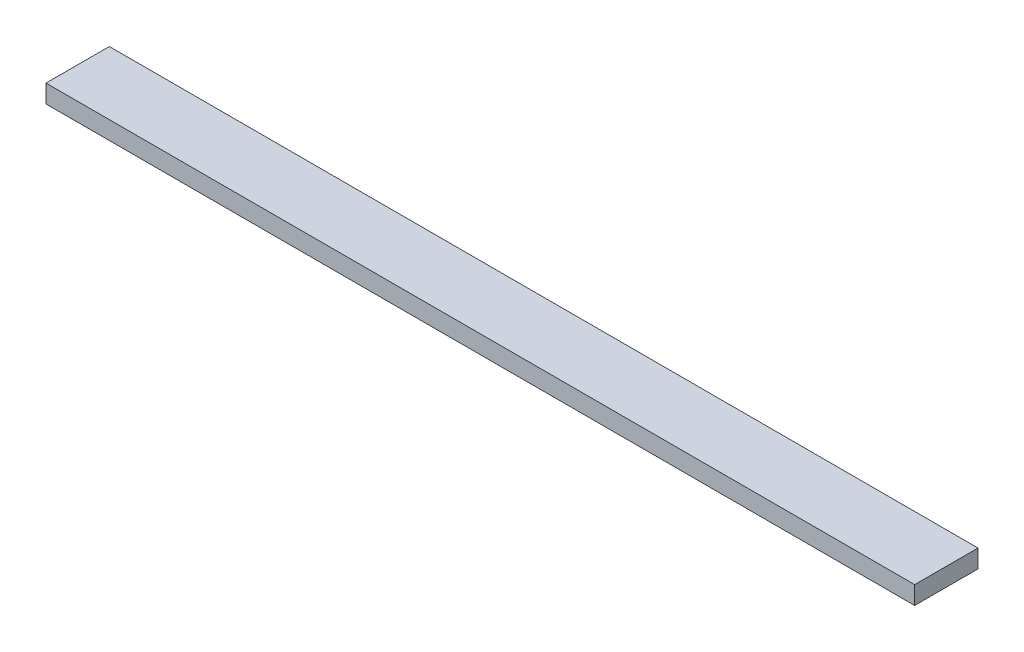
ISO-10303-21;
HEADER;
FILE_DESCRIPTION(('STEP AP214'),'2;1');
FILE_NAME('part.step','',(''),(''),'','','');
FILE_SCHEMA(('AUTOMOTIVE_DESIGN { 1 0 10303 214 1 1 1 1 }'));
ENDSEC;
DATA;
#1=APPLICATION_CONTEXT('core data for automotive mechanical design processes');
#2=APPLICATION_PROTOCOL_DEFINITION('international standard','automotive_design',2000,#1);
#3=PRODUCT_CONTEXT('',#1,'mechanical');
#4=PRODUCT('Part','Part','',(#3));
#5=PRODUCT_RELATED_PRODUCT_CATEGORY('part','',(#4));
#6=PRODUCT_DEFINITION_FORMATION('','',#4);
#7=PRODUCT_DEFINITION_CONTEXT('part definition',#1,'design');
#8=PRODUCT_DEFINITION('design','',#6,#7);
#9=PRODUCT_DEFINITION_SHAPE('','',#8);
#10=(LENGTH_UNIT() NAMED_UNIT(*) SI_UNIT(.MILLI.,.METRE.));
#11=(NAMED_UNIT(*) PLANE_ANGLE_UNIT() SI_UNIT($,.RADIAN.));
#12=(NAMED_UNIT(*) SI_UNIT($,.STERADIAN.) SOLID_ANGLE_UNIT());
#13=UNCERTAINTY_MEASURE_WITH_UNIT(LENGTH_MEASURE(1.E-05),#10,'distance_accuracy_value','');
#14=(GEOMETRIC_REPRESENTATION_CONTEXT(3) GLOBAL_UNCERTAINTY_ASSIGNED_CONTEXT((#13)) GLOBAL_UNIT_ASSIGNED_CONTEXT((#10,
#11,#12)) REPRESENTATION_CONTEXT('',''));
#15=CARTESIAN_POINT('',(0.,0.,0.));
#16=DIRECTION('',(0.,0.,1.));
#17=DIRECTION('',(1.,0.,0.));
#18=AXIS2_PLACEMENT_3D('',#15,#16,#17);
#19=CARTESIAN_POINT('',(152.4,6.35,11.1125));
#20=DIRECTION('',(-1.,0.,0.));
#21=DIRECTION('',(0.,0.,1.));
#22=AXIS2_PLACEMENT_3D('',#19,#20,#21);
#23=PLANE('',#22);
#24=DIRECTION('',(0.,0.,-1.));
#25=VECTOR('',#24,1.);
#26=CARTESIAN_POINT('',(152.4,0.,11.1125));
#27=LINE('',#26,#25);
#28=CARTESIAN_POINT('',(152.4,0.,11.1125));
#29=VERTEX_POINT('',#28);
#30=CARTESIAN_POINT('',(152.4,0.,-11.1125));
#31=VERTEX_POINT('',#30);
#32=EDGE_CURVE('E96',#29,#31,#27,.T.);
#33=ORIENTED_EDGE('',*,*,#32,.T.);
#34=DIRECTION('',(0.,-1.,0.));
#35=VECTOR('',#34,1.);
#36=CARTESIAN_POINT('',(152.4,6.35,-11.1125));
#37=LINE('',#36,#35);
#38=CARTESIAN_POINT('',(152.4,6.35,-11.1125));
#39=VERTEX_POINT('',#38);
#40=EDGE_CURVE('E11',#39,#31,#37,.T.);
#41=ORIENTED_EDGE('',*,*,#40,.F.);
#42=DIRECTION('',(0.,0.,-1.));
#43=VECTOR('',#42,1.);
#44=CARTESIAN_POINT('',(152.4,6.35,11.1125));
#45=LINE('',#44,#43);
#46=CARTESIAN_POINT('',(152.4,6.35,11.1125));
#47=VERTEX_POINT('',#46);
#48=EDGE_CURVE('E84',#47,#39,#45,.T.);
#49=ORIENTED_EDGE('',*,*,#48,.F.);
#50=DIRECTION('',(0.,-1.,0.));
#51=VECTOR('',#50,1.);
#52=CARTESIAN_POINT('',(152.4,6.35,11.1125));
#53=LINE('',#52,#51);
#54=EDGE_CURVE('E92',#47,#29,#53,.T.);
#55=ORIENTED_EDGE('',*,*,#54,.T.);
#56=EDGE_LOOP('',(#33,#41,#49,#55));
#57=FACE_BOUND('',#56,.T.);
#58=ADVANCED_FACE('F33',(#57),#23,.F.);
#59=CARTESIAN_POINT('',(-152.4,6.35,-11.1125));
#60=DIRECTION('',(0.,0.,1.));
#61=DIRECTION('',(1.,0.,0.));
#62=AXIS2_PLACEMENT_3D('',#59,#60,#61);
#63=PLANE('',#62);
#64=DIRECTION('',(-1.,0.,0.));
#65=VECTOR('',#64,1.);
#66=CARTESIAN_POINT('',(-152.4,0.,-11.1125));
#67=LINE('',#66,#65);
#68=CARTESIAN_POINT('',(-152.4,0.,-11.1125));
#69=VERTEX_POINT('',#68);
#70=EDGE_CURVE('E88',#31,#69,#67,.T.);
#71=ORIENTED_EDGE('',*,*,#70,.T.);
#72=DIRECTION('',(0.,-1.,0.));
#73=VECTOR('',#72,1.);
#74=CARTESIAN_POINT('',(-152.4,6.35,-11.1125));
#75=LINE('',#74,#73);
#76=CARTESIAN_POINT('',(-152.4,6.35,-11.1125));
#77=VERTEX_POINT('',#76);
#78=EDGE_CURVE('E41',#77,#69,#75,.T.);
#79=ORIENTED_EDGE('',*,*,#78,.F.);
#80=DIRECTION('',(-1.,0.,0.));
#81=VECTOR('',#80,1.);
#82=CARTESIAN_POINT('',(-152.4,6.35,-11.1125));
#83=LINE('',#82,#81);
#84=EDGE_CURVE('E79',#39,#77,#83,.T.);
#85=ORIENTED_EDGE('',*,*,#84,.F.);
#86=ORIENTED_EDGE('',*,*,#40,.T.);
#87=EDGE_LOOP('',(#71,#79,#85,#86));
#88=FACE_BOUND('',#87,.T.);
#89=ADVANCED_FACE('F87',(#88),#63,.F.);
#90=CARTESIAN_POINT('',(-152.4,6.35,11.1125));
#91=DIRECTION('',(1.,0.,0.));
#92=DIRECTION('',(0.,0.,-1.));
#93=AXIS2_PLACEMENT_3D('',#90,#91,#92);
#94=PLANE('',#93);
#95=DIRECTION('',(0.,0.,1.));
#96=VECTOR('',#95,1.);
#97=CARTESIAN_POINT('',(-152.4,0.,11.1125));
#98=LINE('',#97,#96);
#99=CARTESIAN_POINT('',(-152.4,0.,11.1125));
#100=VERTEX_POINT('',#99);
#101=EDGE_CURVE('E66',#69,#100,#98,.T.);
#102=ORIENTED_EDGE('',*,*,#101,.T.);
#103=DIRECTION('',(0.,-1.,0.));
#104=VECTOR('',#103,1.);
#105=CARTESIAN_POINT('',(-152.4,6.35,11.1125));
#106=LINE('',#105,#104);
#107=CARTESIAN_POINT('',(-152.4,6.35,11.1125));
#108=VERTEX_POINT('',#107);
#109=EDGE_CURVE('E89',#108,#100,#106,.T.);
#110=ORIENTED_EDGE('',*,*,#109,.F.);
#111=DIRECTION('',(0.,0.,1.));
#112=VECTOR('',#111,1.);
#113=CARTESIAN_POINT('',(-152.4,6.35,11.1125));
#114=LINE('',#113,#112);
#115=EDGE_CURVE('E82',#77,#108,#114,.T.);
#116=ORIENTED_EDGE('',*,*,#115,.F.);
#117=ORIENTED_EDGE('',*,*,#78,.T.);
#118=EDGE_LOOP('',(#102,#110,#116,#117));
#119=FACE_BOUND('',#118,.T.);
#120=ADVANCED_FACE('F90',(#119),#94,.F.);
#121=CARTESIAN_POINT('',(-152.4,6.35,11.1125));
#122=DIRECTION('',(0.,0.,-1.));
#123=DIRECTION('',(-1.,0.,0.));
#124=AXIS2_PLACEMENT_3D('',#121,#122,#123);
#125=PLANE('',#124);
#126=DIRECTION('',(1.,0.,0.));
#127=VECTOR('',#126,1.);
#128=CARTESIAN_POINT('',(-152.4,0.,11.1125));
#129=LINE('',#128,#127);
#130=EDGE_CURVE('E72',#100,#29,#129,.T.);
#131=ORIENTED_EDGE('',*,*,#130,.T.);
#132=ORIENTED_EDGE('',*,*,#54,.F.);
#133=DIRECTION('',(1.,0.,0.));
#134=VECTOR('',#133,1.);
#135=CARTESIAN_POINT('',(-152.4,6.35,11.1125));
#136=LINE('',#135,#134);
#137=EDGE_CURVE('E49',#108,#47,#136,.T.);
#138=ORIENTED_EDGE('',*,*,#137,.F.);
#139=ORIENTED_EDGE('',*,*,#109,.T.);
#140=EDGE_LOOP('',(#131,#132,#138,#139));
#141=FACE_BOUND('',#140,.T.);
#142=ADVANCED_FACE('F103',(#141),#125,.F.);
#143=CARTESIAN_POINT('',(0.,6.35,0.));
#144=DIRECTION('',(0.,-1.,0.));
#145=DIRECTION('',(0.,0.,-1.));
#146=AXIS2_PLACEMENT_3D('',#143,#144,#145);
#147=PLANE('',#146);
#148=ORIENTED_EDGE('',*,*,#48,.T.);
#149=ORIENTED_EDGE('',*,*,#84,.T.);
#150=ORIENTED_EDGE('',*,*,#115,.T.);
#151=ORIENTED_EDGE('',*,*,#137,.T.);
#152=EDGE_LOOP('',(#148,#149,#150,#151));
#153=FACE_BOUND('',#152,.T.);
#154=ADVANCED_FACE('F80',(#153),#147,.F.);
#155=CARTESIAN_POINT('',(0.,0.,0.));
#156=DIRECTION('',(0.,-1.,0.));
#157=DIRECTION('',(0.,0.,-1.));
#158=AXIS2_PLACEMENT_3D('',#155,#156,#157);
#159=PLANE('',#158);
#160=ORIENTED_EDGE('',*,*,#32,.F.);
#161=ORIENTED_EDGE('',*,*,#130,.F.);
#162=ORIENTED_EDGE('',*,*,#101,.F.);
#163=ORIENTED_EDGE('',*,*,#70,.F.);
#164=EDGE_LOOP('',(#160,#161,#162,#163));
#165=FACE_BOUND('',#164,.T.);
#166=ADVANCED_FACE('F106',(#165),#159,.T.);
#167=CLOSED_SHELL('',(#58,#89,#120,#142,#154,#166));
#168=MANIFOLD_SOLID_BREP('B2',#167);
#169=ADVANCED_BREP_SHAPE_REPRESENTATION('',(#18,#168),#14);
#170=SHAPE_DEFINITION_REPRESENTATION(#9,#169);
ENDSEC;
END-ISO-10303-21;
